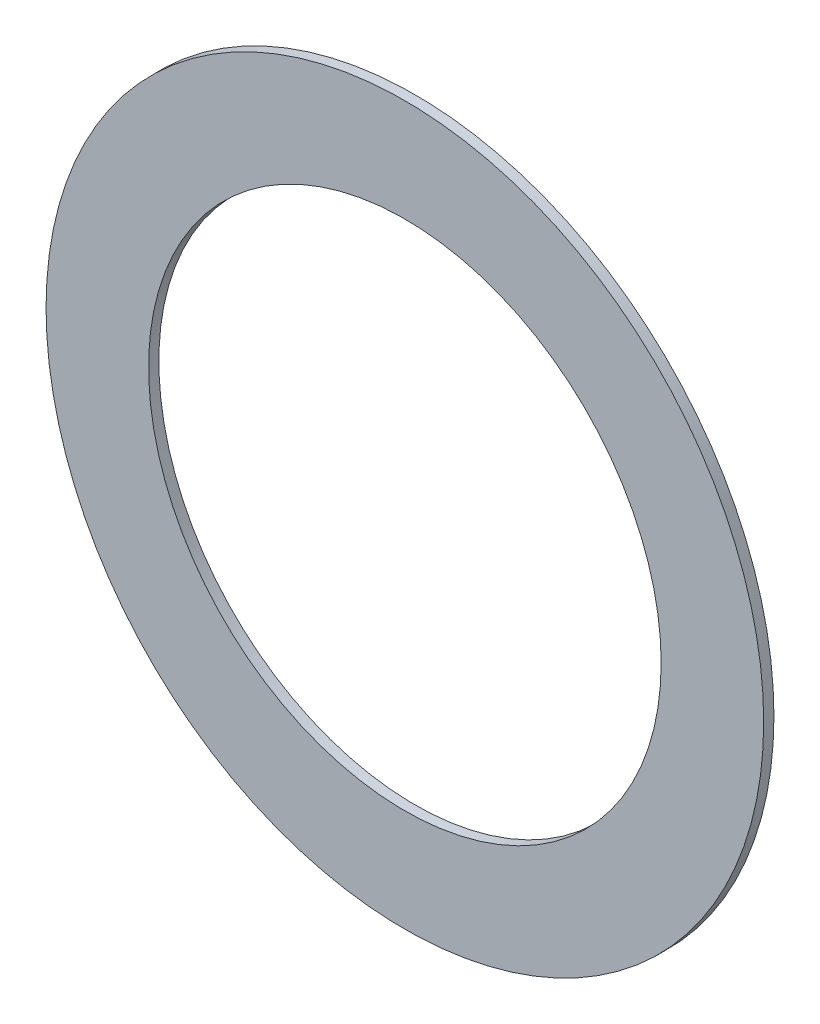
ISO-10303-21;
HEADER;
FILE_DESCRIPTION(('STEP AP214'),'2;1');
FILE_NAME('part.step','',(''),(''),'','','');
FILE_SCHEMA(('AUTOMOTIVE_DESIGN { 1 0 10303 214 1 1 1 1 }'));
ENDSEC;
DATA;
#1=APPLICATION_CONTEXT('core data for automotive mechanical design processes');
#2=APPLICATION_PROTOCOL_DEFINITION('international standard','automotive_design',2000,#1);
#3=PRODUCT_CONTEXT('',#1,'mechanical');
#4=PRODUCT('Part','Part','',(#3));
#5=PRODUCT_RELATED_PRODUCT_CATEGORY('part','',(#4));
#6=PRODUCT_DEFINITION_FORMATION('','',#4);
#7=PRODUCT_DEFINITION_CONTEXT('part definition',#1,'design');
#8=PRODUCT_DEFINITION('design','',#6,#7);
#9=PRODUCT_DEFINITION_SHAPE('','',#8);
#10=(LENGTH_UNIT() NAMED_UNIT(*) SI_UNIT(.MILLI.,.METRE.));
#11=(NAMED_UNIT(*) PLANE_ANGLE_UNIT() SI_UNIT($,.RADIAN.));
#12=(NAMED_UNIT(*) SI_UNIT($,.STERADIAN.) SOLID_ANGLE_UNIT());
#13=UNCERTAINTY_MEASURE_WITH_UNIT(LENGTH_MEASURE(1.E-05),#10,'distance_accuracy_value','');
#14=(GEOMETRIC_REPRESENTATION_CONTEXT(3) GLOBAL_UNCERTAINTY_ASSIGNED_CONTEXT((#13)) GLOBAL_UNIT_ASSIGNED_CONTEXT((#10,
#11,#12)) REPRESENTATION_CONTEXT('',''));
#15=CARTESIAN_POINT('',(0.,0.,0.));
#16=DIRECTION('',(0.,0.,1.));
#17=DIRECTION('',(1.,0.,0.));
#18=AXIS2_PLACEMENT_3D('',#15,#16,#17);
#19=CARTESIAN_POINT('',(0.,0.,1.));
#20=DIRECTION('',(0.,0.,1.));
#21=DIRECTION('',(1.,0.,0.));
#22=AXIS2_PLACEMENT_3D('',#19,#20,#21);
#23=PLANE('',#22);
#24=CARTESIAN_POINT('',(0.,0.,1.));
#25=DIRECTION('',(0.,0.,1.));
#26=DIRECTION('',(1.,0.,0.));
#27=AXIS2_PLACEMENT_3D('',#24,#25,#26);
#28=CIRCLE('',#27,35.);
#29=CARTESIAN_POINT('',(35.,0.,1.));
#30=VERTEX_POINT('',#29);
#31=EDGE_CURVE('E10',#30,#30,#28,.T.);
#32=ORIENTED_EDGE('',*,*,#31,.T.);
#33=EDGE_LOOP('',(#32));
#34=FACE_BOUND('',#33,.T.);
#35=CARTESIAN_POINT('',(0.,0.,1.));
#36=DIRECTION('',(0.,0.,1.));
#37=DIRECTION('',(1.,0.,0.));
#38=AXIS2_PLACEMENT_3D('',#35,#36,#37);
#39=CIRCLE('',#38,25.);
#40=CARTESIAN_POINT('',(25.,0.,1.));
#41=VERTEX_POINT('',#40);
#42=EDGE_CURVE('E42',#41,#41,#39,.T.);
#43=ORIENTED_EDGE('',*,*,#42,.F.);
#44=EDGE_LOOP('',(#43));
#45=FACE_BOUND('',#44,.T.);
#46=ADVANCED_FACE('F31',(#34,#45),#23,.T.);
#47=CARTESIAN_POINT('',(0.,0.,0.));
#48=DIRECTION('',(0.,0.,1.));
#49=DIRECTION('',(1.,0.,0.));
#50=AXIS2_PLACEMENT_3D('',#47,#48,#49);
#51=PLANE('',#50);
#52=CARTESIAN_POINT('',(0.,0.,0.));
#53=DIRECTION('',(0.,0.,1.));
#54=DIRECTION('',(1.,0.,0.));
#55=AXIS2_PLACEMENT_3D('',#52,#53,#54);
#56=CIRCLE('',#55,35.);
#57=CARTESIAN_POINT('',(35.,0.,0.));
#58=VERTEX_POINT('',#57);
#59=EDGE_CURVE('E35',#58,#58,#56,.T.);
#60=ORIENTED_EDGE('',*,*,#59,.F.);
#61=EDGE_LOOP('',(#60));
#62=FACE_BOUND('',#61,.T.);
#63=CARTESIAN_POINT('',(0.,0.,0.));
#64=DIRECTION('',(0.,0.,1.));
#65=DIRECTION('',(1.,0.,0.));
#66=AXIS2_PLACEMENT_3D('',#63,#64,#65);
#67=CIRCLE('',#66,25.);
#68=CARTESIAN_POINT('',(25.,0.,0.));
#69=VERTEX_POINT('',#68);
#70=EDGE_CURVE('E44',#69,#69,#67,.T.);
#71=ORIENTED_EDGE('',*,*,#70,.T.);
#72=EDGE_LOOP('',(#71));
#73=FACE_BOUND('',#72,.T.);
#74=ADVANCED_FACE('F54',(#62,#73),#51,.F.);
#75=CARTESIAN_POINT('',(0.,0.,1.));
#76=DIRECTION('',(0.,0.,-1.));
#77=DIRECTION('',(-1.,0.,0.));
#78=AXIS2_PLACEMENT_3D('',#75,#76,#77);
#79=CYLINDRICAL_SURFACE('',#78,35.);
#80=ORIENTED_EDGE('',*,*,#31,.F.);
#81=EDGE_LOOP('',(#80));
#82=FACE_BOUND('',#81,.T.);
#83=ORIENTED_EDGE('',*,*,#59,.T.);
#84=EDGE_LOOP('',(#83));
#85=FACE_BOUND('',#84,.T.);
#86=ADVANCED_FACE('F33',(#82,#85),#79,.T.);
#87=CARTESIAN_POINT('',(0.,0.,1.));
#88=DIRECTION('',(0.,0.,-1.));
#89=DIRECTION('',(-1.,0.,0.));
#90=AXIS2_PLACEMENT_3D('',#87,#88,#89);
#91=CYLINDRICAL_SURFACE('',#90,25.);
#92=ORIENTED_EDGE('',*,*,#42,.T.);
#93=EDGE_LOOP('',(#92));
#94=FACE_BOUND('',#93,.T.);
#95=ORIENTED_EDGE('',*,*,#70,.F.);
#96=EDGE_LOOP('',(#95));
#97=FACE_BOUND('',#96,.T.);
#98=ADVANCED_FACE('F50',(#94,#97),#91,.F.);
#99=CLOSED_SHELL('',(#46,#74,#86,#98));
#100=MANIFOLD_SOLID_BREP('B2',#99);
#101=ADVANCED_BREP_SHAPE_REPRESENTATION('',(#18,#100),#14);
#102=SHAPE_DEFINITION_REPRESENTATION(#9,#101);
ENDSEC;
END-ISO-10303-21;
